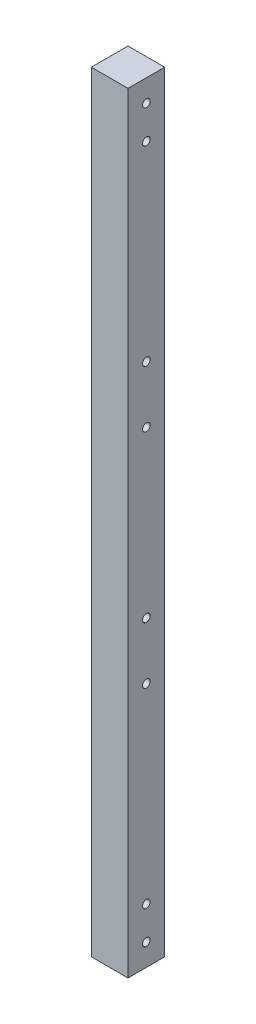
ISO-10303-21;
HEADER;
FILE_DESCRIPTION(('STEP AP214'),'2;1');
FILE_NAME('part.step','',(''),(''),'','','');
FILE_SCHEMA(('AUTOMOTIVE_DESIGN { 1 0 10303 214 1 1 1 1 }'));
ENDSEC;
DATA;
#1=APPLICATION_CONTEXT('core data for automotive mechanical design processes');
#2=APPLICATION_PROTOCOL_DEFINITION('international standard','automotive_design',2000,#1);
#3=PRODUCT_CONTEXT('',#1,'mechanical');
#4=PRODUCT('Part','Part','',(#3));
#5=PRODUCT_RELATED_PRODUCT_CATEGORY('part','',(#4));
#6=PRODUCT_DEFINITION_FORMATION('','',#4);
#7=PRODUCT_DEFINITION_CONTEXT('part definition',#1,'design');
#8=PRODUCT_DEFINITION('design','',#6,#7);
#9=PRODUCT_DEFINITION_SHAPE('','',#8);
#10=(LENGTH_UNIT() NAMED_UNIT(*) SI_UNIT(.MILLI.,.METRE.));
#11=(NAMED_UNIT(*) PLANE_ANGLE_UNIT() SI_UNIT($,.RADIAN.));
#12=(NAMED_UNIT(*) SI_UNIT($,.STERADIAN.) SOLID_ANGLE_UNIT());
#13=UNCERTAINTY_MEASURE_WITH_UNIT(LENGTH_MEASURE(1.E-05),#10,'distance_accuracy_value','');
#14=(GEOMETRIC_REPRESENTATION_CONTEXT(3) GLOBAL_UNCERTAINTY_ASSIGNED_CONTEXT((#13)) GLOBAL_UNIT_ASSIGNED_CONTEXT((#10,
#11,#12)) REPRESENTATION_CONTEXT('',''));
#15=CARTESIAN_POINT('',(0.,0.,0.));
#16=DIRECTION('',(0.,0.,1.));
#17=DIRECTION('',(1.,0.,0.));
#18=AXIS2_PLACEMENT_3D('',#15,#16,#17);
#19=CARTESIAN_POINT('',(-14.8983739837398,420.,-2.41869918699187));
#20=DIRECTION('',(1.,0.,0.));
#21=DIRECTION('',(0.,0.,-1.));
#22=AXIS2_PLACEMENT_3D('',#19,#20,#21);
#23=PLANE('',#22);
#24=CARTESIAN_POINT('',(-14.8983739837398,286.,7.58130081300811));
#25=DIRECTION('',(1.,0.,0.));
#26=DIRECTION('',(0.,0.,-1.));
#27=AXIS2_PLACEMENT_3D('',#24,#25,#26);
#28=CIRCLE('',#27,2.1);
#29=CARTESIAN_POINT('',(-14.8983739837398,286.,5.48130081300812));
#30=VERTEX_POINT('',#29);
#31=EDGE_CURVE('E140',#30,#30,#28,.T.);
#32=ORIENTED_EDGE('',*,*,#31,.T.);
#33=EDGE_LOOP('',(#32));
#34=FACE_BOUND('',#33,.T.);
#35=CARTESIAN_POINT('',(-14.8983739837398,134.,7.58130081300811));
#36=DIRECTION('',(1.,0.,0.));
#37=DIRECTION('',(0.,0.,1.));
#38=AXIS2_PLACEMENT_3D('',#35,#36,#37);
#39=CIRCLE('',#38,2.1);
#40=CARTESIAN_POINT('',(-14.8983739837398,134.,9.68130081300811));
#41=VERTEX_POINT('',#40);
#42=EDGE_CURVE('E146',#41,#41,#39,.T.);
#43=ORIENTED_EDGE('',*,*,#42,.T.);
#44=EDGE_LOOP('',(#43));
#45=FACE_BOUND('',#44,.T.);
#46=CARTESIAN_POINT('',(-14.8983739837398,165.,7.58130081300811));
#47=DIRECTION('',(1.,0.,0.));
#48=DIRECTION('',(0.,0.,1.));
#49=AXIS2_PLACEMENT_3D('',#46,#47,#48);
#50=CIRCLE('',#49,2.1);
#51=CARTESIAN_POINT('',(-14.8983739837398,165.,9.68130081300811));
#52=VERTEX_POINT('',#51);
#53=EDGE_CURVE('E147',#52,#52,#50,.T.);
#54=ORIENTED_EDGE('',*,*,#53,.T.);
#55=EDGE_LOOP('',(#54));
#56=FACE_BOUND('',#55,.T.);
#57=CARTESIAN_POINT('',(-14.8983739837398,255.,7.58130081300811));
#58=DIRECTION('',(1.,0.,0.));
#59=DIRECTION('',(0.,0.,-1.));
#60=AXIS2_PLACEMENT_3D('',#57,#58,#59);
#61=CIRCLE('',#60,2.1);
#62=CARTESIAN_POINT('',(-14.8983739837398,255.,5.48130081300811));
#63=VERTEX_POINT('',#62);
#64=EDGE_CURVE('E123',#63,#63,#61,.T.);
#65=ORIENTED_EDGE('',*,*,#64,.T.);
#66=EDGE_LOOP('',(#65));
#67=FACE_BOUND('',#66,.T.);
#68=CARTESIAN_POINT('',(-14.8983739837398,12.,7.58130081300813));
#69=DIRECTION('',(1.,0.,0.));
#70=DIRECTION('',(0.,0.,1.));
#71=AXIS2_PLACEMENT_3D('',#68,#69,#70);
#72=CIRCLE('',#71,2.1);
#73=CARTESIAN_POINT('',(-14.8983739837398,12.,9.68130081300812));
#74=VERTEX_POINT('',#73);
#75=EDGE_CURVE('E122',#74,#74,#72,.T.);
#76=ORIENTED_EDGE('',*,*,#75,.T.);
#77=EDGE_LOOP('',(#76));
#78=FACE_BOUND('',#77,.T.);
#79=CARTESIAN_POINT('',(-14.8983739837398,30.,7.58130081300813));
#80=DIRECTION('',(1.,0.,0.));
#81=DIRECTION('',(0.,0.,1.));
#82=AXIS2_PLACEMENT_3D('',#79,#80,#81);
#83=CIRCLE('',#82,2.1);
#84=CARTESIAN_POINT('',(-14.8983739837398,30.,9.68130081300812));
#85=VERTEX_POINT('',#84);
#86=EDGE_CURVE('E129',#85,#85,#83,.T.);
#87=ORIENTED_EDGE('',*,*,#86,.T.);
#88=EDGE_LOOP('',(#87));
#89=FACE_BOUND('',#88,.T.);
#90=CARTESIAN_POINT('',(-14.8983739837398,408.,7.58130081300813));
#91=DIRECTION('',(1.,0.,0.));
#92=DIRECTION('',(0.,0.,-1.));
#93=AXIS2_PLACEMENT_3D('',#90,#91,#92);
#94=CIRCLE('',#93,2.09999999999999);
#95=CARTESIAN_POINT('',(-14.8983739837398,408.,5.48130081300814));
#96=VERTEX_POINT('',#95);
#97=EDGE_CURVE('E116',#96,#96,#94,.T.);
#98=ORIENTED_EDGE('',*,*,#97,.T.);
#99=EDGE_LOOP('',(#98));
#100=FACE_BOUND('',#99,.T.);
#101=CARTESIAN_POINT('',(-14.8983739837398,390.,7.58130081300813));
#102=DIRECTION('',(1.,0.,0.));
#103=DIRECTION('',(0.,0.,-1.));
#104=AXIS2_PLACEMENT_3D('',#101,#102,#103);
#105=CIRCLE('',#104,2.09999999999999);
#106=CARTESIAN_POINT('',(-14.8983739837398,390.,5.48130081300813));
#107=VERTEX_POINT('',#106);
#108=EDGE_CURVE('E102',#107,#107,#105,.T.);
#109=ORIENTED_EDGE('',*,*,#108,.T.);
#110=EDGE_LOOP('',(#109));
#111=FACE_BOUND('',#110,.T.);
#112=DIRECTION('',(0.,0.,1.));
#113=VECTOR('',#112,1.);
#114=CARTESIAN_POINT('',(-14.8983739837398,0.,-2.41869918699187));
#115=LINE('',#114,#113);
#116=CARTESIAN_POINT('',(-14.8983739837398,0.,-2.41869918699187));
#117=VERTEX_POINT('',#116);
#118=CARTESIAN_POINT('',(-14.8983739837398,0.,17.5813008130081));
#119=VERTEX_POINT('',#118);
#120=EDGE_CURVE('E99',#117,#119,#115,.T.);
#121=ORIENTED_EDGE('',*,*,#120,.T.);
#122=DIRECTION('',(0.,-1.,0.));
#123=VECTOR('',#122,1.);
#124=CARTESIAN_POINT('',(-14.8983739837398,420.,17.5813008130081));
#125=LINE('',#124,#123);
#126=CARTESIAN_POINT('',(-14.8983739837398,420.,17.5813008130081));
#127=VERTEX_POINT('',#126);
#128=EDGE_CURVE('E11',#127,#119,#125,.T.);
#129=ORIENTED_EDGE('',*,*,#128,.F.);
#130=DIRECTION('',(0.,0.,1.));
#131=VECTOR('',#130,1.);
#132=CARTESIAN_POINT('',(-14.8983739837398,420.,-2.41869918699187));
#133=LINE('',#132,#131);
#134=CARTESIAN_POINT('',(-14.8983739837398,420.,-2.41869918699187));
#135=VERTEX_POINT('',#134);
#136=EDGE_CURVE('E87',#135,#127,#133,.T.);
#137=ORIENTED_EDGE('',*,*,#136,.F.);
#138=DIRECTION('',(0.,-1.,0.));
#139=VECTOR('',#138,1.);
#140=CARTESIAN_POINT('',(-14.8983739837398,420.,-2.41869918699187));
#141=LINE('',#140,#139);
#142=EDGE_CURVE('E95',#135,#117,#141,.T.);
#143=ORIENTED_EDGE('',*,*,#142,.T.);
#144=EDGE_LOOP('',(#121,#129,#137,#143));
#145=FACE_BOUND('',#144,.T.);
#146=ADVANCED_FACE('F36',(#34,#45,#56,#67,#78,#89,#100,#111,#145),#23,.F.);
#147=CARTESIAN_POINT('',(-14.8983739837398,420.,17.5813008130081));
#148=DIRECTION('',(0.,0.,-1.));
#149=DIRECTION('',(-1.,0.,0.));
#150=AXIS2_PLACEMENT_3D('',#147,#148,#149);
#151=PLANE('',#150);
#152=DIRECTION('',(1.,0.,0.));
#153=VECTOR('',#152,1.);
#154=CARTESIAN_POINT('',(-14.8983739837398,0.,17.5813008130081));
#155=LINE('',#154,#153);
#156=CARTESIAN_POINT('',(5.10162601626017,0.,17.5813008130081));
#157=VERTEX_POINT('',#156);
#158=EDGE_CURVE('E91',#119,#157,#155,.T.);
#159=ORIENTED_EDGE('',*,*,#158,.T.);
#160=DIRECTION('',(0.,-1.,0.));
#161=VECTOR('',#160,1.);
#162=CARTESIAN_POINT('',(5.10162601626017,420.,17.5813008130081));
#163=LINE('',#162,#161);
#164=CARTESIAN_POINT('',(5.10162601626017,420.,17.5813008130081));
#165=VERTEX_POINT('',#164);
#166=EDGE_CURVE('E44',#165,#157,#163,.T.);
#167=ORIENTED_EDGE('',*,*,#166,.F.);
#168=DIRECTION('',(1.,0.,0.));
#169=VECTOR('',#168,1.);
#170=CARTESIAN_POINT('',(-14.8983739837398,420.,17.5813008130081));
#171=LINE('',#170,#169);
#172=EDGE_CURVE('E82',#127,#165,#171,.T.);
#173=ORIENTED_EDGE('',*,*,#172,.F.);
#174=ORIENTED_EDGE('',*,*,#128,.T.);
#175=EDGE_LOOP('',(#159,#167,#173,#174));
#176=FACE_BOUND('',#175,.T.);
#177=ADVANCED_FACE('F90',(#176),#151,.F.);
#178=CARTESIAN_POINT('',(5.10162601626017,420.,-2.41869918699187));
#179=DIRECTION('',(-1.,0.,0.));
#180=DIRECTION('',(0.,0.,1.));
#181=AXIS2_PLACEMENT_3D('',#178,#179,#180);
#182=PLANE('',#181);
#183=CARTESIAN_POINT('',(5.10162601626017,286.,7.58130081300811));
#184=DIRECTION('',(1.,0.,0.));
#185=DIRECTION('',(0.,0.,-1.));
#186=AXIS2_PLACEMENT_3D('',#183,#184,#185);
#187=CIRCLE('',#186,2.1);
#188=CARTESIAN_POINT('',(5.10162601626017,286.,5.48130081300812));
#189=VERTEX_POINT('',#188);
#190=EDGE_CURVE('E150',#189,#189,#187,.T.);
#191=ORIENTED_EDGE('',*,*,#190,.F.);
#192=EDGE_LOOP('',(#191));
#193=FACE_BOUND('',#192,.T.);
#194=CARTESIAN_POINT('',(5.10162601626017,134.,7.58130081300811));
#195=DIRECTION('',(1.,0.,0.));
#196=DIRECTION('',(0.,0.,1.));
#197=AXIS2_PLACEMENT_3D('',#194,#195,#196);
#198=CIRCLE('',#197,2.1);
#199=CARTESIAN_POINT('',(5.10162601626017,134.,9.68130081300811));
#200=VERTEX_POINT('',#199);
#201=EDGE_CURVE('E143',#200,#200,#198,.T.);
#202=ORIENTED_EDGE('',*,*,#201,.F.);
#203=EDGE_LOOP('',(#202));
#204=FACE_BOUND('',#203,.T.);
#205=CARTESIAN_POINT('',(5.10162601626017,165.,7.58130081300811));
#206=DIRECTION('',(1.,0.,0.));
#207=DIRECTION('',(0.,0.,1.));
#208=AXIS2_PLACEMENT_3D('',#205,#206,#207);
#209=CIRCLE('',#208,2.1);
#210=CARTESIAN_POINT('',(5.10162601626017,165.,9.68130081300811));
#211=VERTEX_POINT('',#210);
#212=EDGE_CURVE('E155',#211,#211,#209,.T.);
#213=ORIENTED_EDGE('',*,*,#212,.F.);
#214=EDGE_LOOP('',(#213));
#215=FACE_BOUND('',#214,.T.);
#216=CARTESIAN_POINT('',(5.10162601626017,255.,7.58130081300811));
#217=DIRECTION('',(1.,0.,0.));
#218=DIRECTION('',(0.,0.,-1.));
#219=AXIS2_PLACEMENT_3D('',#216,#217,#218);
#220=CIRCLE('',#219,2.1);
#221=CARTESIAN_POINT('',(5.10162601626017,255.,5.48130081300811));
#222=VERTEX_POINT('',#221);
#223=EDGE_CURVE('E137',#222,#222,#220,.T.);
#224=ORIENTED_EDGE('',*,*,#223,.F.);
#225=EDGE_LOOP('',(#224));
#226=FACE_BOUND('',#225,.T.);
#227=CARTESIAN_POINT('',(5.10162601626017,12.,7.58130081300813));
#228=DIRECTION('',(1.,0.,0.));
#229=DIRECTION('',(0.,0.,1.));
#230=AXIS2_PLACEMENT_3D('',#227,#228,#229);
#231=CIRCLE('',#230,2.1);
#232=CARTESIAN_POINT('',(5.10162601626017,12.,9.68130081300812));
#233=VERTEX_POINT('',#232);
#234=EDGE_CURVE('E119',#233,#233,#231,.T.);
#235=ORIENTED_EDGE('',*,*,#234,.F.);
#236=EDGE_LOOP('',(#235));
#237=FACE_BOUND('',#236,.T.);
#238=CARTESIAN_POINT('',(5.10162601626017,30.,7.58130081300813));
#239=DIRECTION('',(1.,0.,0.));
#240=DIRECTION('',(0.,0.,1.));
#241=AXIS2_PLACEMENT_3D('',#238,#239,#240);
#242=CIRCLE('',#241,2.1);
#243=CARTESIAN_POINT('',(5.10162601626017,30.,9.68130081300812));
#244=VERTEX_POINT('',#243);
#245=EDGE_CURVE('E126',#244,#244,#242,.T.);
#246=ORIENTED_EDGE('',*,*,#245,.F.);
#247=EDGE_LOOP('',(#246));
#248=FACE_BOUND('',#247,.T.);
#249=CARTESIAN_POINT('',(5.10162601626017,408.,7.58130081300813));
#250=DIRECTION('',(1.,0.,0.));
#251=DIRECTION('',(0.,0.,-1.));
#252=AXIS2_PLACEMENT_3D('',#249,#250,#251);
#253=CIRCLE('',#252,2.09999999999999);
#254=CARTESIAN_POINT('',(5.10162601626017,408.,5.48130081300814));
#255=VERTEX_POINT('',#254);
#256=EDGE_CURVE('E132',#255,#255,#253,.T.);
#257=ORIENTED_EDGE('',*,*,#256,.F.);
#258=EDGE_LOOP('',(#257));
#259=FACE_BOUND('',#258,.T.);
#260=CARTESIAN_POINT('',(5.10162601626017,390.,7.58130081300813));
#261=DIRECTION('',(1.,0.,0.));
#262=DIRECTION('',(0.,0.,-1.));
#263=AXIS2_PLACEMENT_3D('',#260,#261,#262);
#264=CIRCLE('',#263,2.09999999999999);
#265=CARTESIAN_POINT('',(5.10162601626017,390.,5.48130081300813));
#266=VERTEX_POINT('',#265);
#267=EDGE_CURVE('E113',#266,#266,#264,.T.);
#268=ORIENTED_EDGE('',*,*,#267,.F.);
#269=EDGE_LOOP('',(#268));
#270=FACE_BOUND('',#269,.T.);
#271=DIRECTION('',(0.,0.,-1.));
#272=VECTOR('',#271,1.);
#273=CARTESIAN_POINT('',(5.10162601626017,0.,-2.41869918699187));
#274=LINE('',#273,#272);
#275=CARTESIAN_POINT('',(5.10162601626017,0.,-2.41869918699187));
#276=VERTEX_POINT('',#275);
#277=EDGE_CURVE('E69',#157,#276,#274,.T.);
#278=ORIENTED_EDGE('',*,*,#277,.T.);
#279=DIRECTION('',(0.,-1.,0.));
#280=VECTOR('',#279,1.);
#281=CARTESIAN_POINT('',(5.10162601626017,420.,-2.41869918699187));
#282=LINE('',#281,#280);
#283=CARTESIAN_POINT('',(5.10162601626017,420.,-2.41869918699187));
#284=VERTEX_POINT('',#283);
#285=EDGE_CURVE('E92',#284,#276,#282,.T.);
#286=ORIENTED_EDGE('',*,*,#285,.F.);
#287=DIRECTION('',(0.,0.,-1.));
#288=VECTOR('',#287,1.);
#289=CARTESIAN_POINT('',(5.10162601626017,420.,-2.41869918699187));
#290=LINE('',#289,#288);
#291=EDGE_CURVE('E85',#165,#284,#290,.T.);
#292=ORIENTED_EDGE('',*,*,#291,.F.);
#293=ORIENTED_EDGE('',*,*,#166,.T.);
#294=EDGE_LOOP('',(#278,#286,#292,#293));
#295=FACE_BOUND('',#294,.T.);
#296=ADVANCED_FACE('F93',(#193,#204,#215,#226,#237,#248,#259,#270,#295),#182,.F.);
#297=CARTESIAN_POINT('',(-14.8983739837398,420.,-2.41869918699187));
#298=DIRECTION('',(0.,0.,1.));
#299=DIRECTION('',(1.,0.,0.));
#300=AXIS2_PLACEMENT_3D('',#297,#298,#299);
#301=PLANE('',#300);
#302=DIRECTION('',(-1.,0.,0.));
#303=VECTOR('',#302,1.);
#304=CARTESIAN_POINT('',(-14.8983739837398,0.,-2.41869918699187));
#305=LINE('',#304,#303);
#306=EDGE_CURVE('E75',#276,#117,#305,.T.);
#307=ORIENTED_EDGE('',*,*,#306,.T.);
#308=ORIENTED_EDGE('',*,*,#142,.F.);
#309=DIRECTION('',(-1.,0.,0.));
#310=VECTOR('',#309,1.);
#311=CARTESIAN_POINT('',(-14.8983739837398,420.,-2.41869918699187));
#312=LINE('',#311,#310);
#313=EDGE_CURVE('E52',#284,#135,#312,.T.);
#314=ORIENTED_EDGE('',*,*,#313,.F.);
#315=ORIENTED_EDGE('',*,*,#285,.T.);
#316=EDGE_LOOP('',(#307,#308,#314,#315));
#317=FACE_BOUND('',#316,.T.);
#318=ADVANCED_FACE('F107',(#317),#301,.F.);
#319=CARTESIAN_POINT('',(0.,420.,0.));
#320=DIRECTION('',(0.,1.,0.));
#321=DIRECTION('',(0.,0.,1.));
#322=AXIS2_PLACEMENT_3D('',#319,#320,#321);
#323=PLANE('',#322);
#324=ORIENTED_EDGE('',*,*,#136,.T.);
#325=ORIENTED_EDGE('',*,*,#172,.T.);
#326=ORIENTED_EDGE('',*,*,#291,.T.);
#327=ORIENTED_EDGE('',*,*,#313,.T.);
#328=EDGE_LOOP('',(#324,#325,#326,#327));
#329=FACE_BOUND('',#328,.T.);
#330=ADVANCED_FACE('F83',(#329),#323,.T.);
#331=CARTESIAN_POINT('',(0.,0.,0.));
#332=DIRECTION('',(0.,1.,0.));
#333=DIRECTION('',(0.,0.,1.));
#334=AXIS2_PLACEMENT_3D('',#331,#332,#333);
#335=PLANE('',#334);
#336=ORIENTED_EDGE('',*,*,#120,.F.);
#337=ORIENTED_EDGE('',*,*,#306,.F.);
#338=ORIENTED_EDGE('',*,*,#277,.F.);
#339=ORIENTED_EDGE('',*,*,#158,.F.);
#340=EDGE_LOOP('',(#336,#337,#338,#339));
#341=FACE_BOUND('',#340,.T.);
#342=ADVANCED_FACE('F110',(#341),#335,.F.);
#343=CARTESIAN_POINT('',(-14.8983739837398,390.,7.58130081300813));
#344=DIRECTION('',(1.,0.,0.));
#345=DIRECTION('',(0.,0.,-1.));
#346=AXIS2_PLACEMENT_3D('',#343,#344,#345);
#347=CYLINDRICAL_SURFACE('',#346,2.09999999999999);
#348=ORIENTED_EDGE('',*,*,#108,.F.);
#349=EDGE_LOOP('',(#348));
#350=FACE_BOUND('',#349,.T.);
#351=ORIENTED_EDGE('',*,*,#267,.T.);
#352=EDGE_LOOP('',(#351));
#353=FACE_BOUND('',#352,.T.);
#354=ADVANCED_FACE('F185',(#350,#353),#347,.F.);
#355=CARTESIAN_POINT('',(-14.8983739837398,408.,7.58130081300813));
#356=DIRECTION('',(1.,0.,0.));
#357=DIRECTION('',(0.,0.,-1.));
#358=AXIS2_PLACEMENT_3D('',#355,#356,#357);
#359=CYLINDRICAL_SURFACE('',#358,2.09999999999999);
#360=ORIENTED_EDGE('',*,*,#97,.F.);
#361=EDGE_LOOP('',(#360));
#362=FACE_BOUND('',#361,.T.);
#363=ORIENTED_EDGE('',*,*,#256,.T.);
#364=EDGE_LOOP('',(#363));
#365=FACE_BOUND('',#364,.T.);
#366=ADVANCED_FACE('F187',(#362,#365),#359,.F.);
#367=CARTESIAN_POINT('',(-14.8983739837398,30.,7.58130081300813));
#368=DIRECTION('',(1.,0.,0.));
#369=DIRECTION('',(0.,0.,-1.));
#370=AXIS2_PLACEMENT_3D('',#367,#368,#369);
#371=CYLINDRICAL_SURFACE('',#370,2.1);
#372=ORIENTED_EDGE('',*,*,#86,.F.);
#373=EDGE_LOOP('',(#372));
#374=FACE_BOUND('',#373,.T.);
#375=ORIENTED_EDGE('',*,*,#245,.T.);
#376=EDGE_LOOP('',(#375));
#377=FACE_BOUND('',#376,.T.);
#378=ADVANCED_FACE('F194',(#374,#377),#371,.F.);
#379=CARTESIAN_POINT('',(-14.8983739837398,12.,7.58130081300813));
#380=DIRECTION('',(1.,0.,0.));
#381=DIRECTION('',(0.,0.,-1.));
#382=AXIS2_PLACEMENT_3D('',#379,#380,#381);
#383=CYLINDRICAL_SURFACE('',#382,2.1);
#384=ORIENTED_EDGE('',*,*,#75,.F.);
#385=EDGE_LOOP('',(#384));
#386=FACE_BOUND('',#385,.T.);
#387=ORIENTED_EDGE('',*,*,#234,.T.);
#388=EDGE_LOOP('',(#387));
#389=FACE_BOUND('',#388,.T.);
#390=ADVANCED_FACE('F223',(#386,#389),#383,.F.);
#391=CARTESIAN_POINT('',(-14.8983739837398,255.,7.58130081300811));
#392=DIRECTION('',(1.,0.,0.));
#393=DIRECTION('',(0.,0.,-1.));
#394=AXIS2_PLACEMENT_3D('',#391,#392,#393);
#395=CYLINDRICAL_SURFACE('',#394,2.1);
#396=ORIENTED_EDGE('',*,*,#64,.F.);
#397=EDGE_LOOP('',(#396));
#398=FACE_BOUND('',#397,.T.);
#399=ORIENTED_EDGE('',*,*,#223,.T.);
#400=EDGE_LOOP('',(#399));
#401=FACE_BOUND('',#400,.T.);
#402=ADVANCED_FACE('F167',(#398,#401),#395,.F.);
#403=CARTESIAN_POINT('',(-14.8983739837398,165.,7.58130081300811));
#404=DIRECTION('',(1.,0.,0.));
#405=DIRECTION('',(0.,0.,-1.));
#406=AXIS2_PLACEMENT_3D('',#403,#404,#405);
#407=CYLINDRICAL_SURFACE('',#406,2.1);
#408=ORIENTED_EDGE('',*,*,#53,.F.);
#409=EDGE_LOOP('',(#408));
#410=FACE_BOUND('',#409,.T.);
#411=ORIENTED_EDGE('',*,*,#212,.T.);
#412=EDGE_LOOP('',(#411));
#413=FACE_BOUND('',#412,.T.);
#414=ADVANCED_FACE('F163',(#410,#413),#407,.F.);
#415=CARTESIAN_POINT('',(-14.8983739837398,134.,7.58130081300811));
#416=DIRECTION('',(1.,0.,0.));
#417=DIRECTION('',(0.,0.,-1.));
#418=AXIS2_PLACEMENT_3D('',#415,#416,#417);
#419=CYLINDRICAL_SURFACE('',#418,2.1);
#420=ORIENTED_EDGE('',*,*,#42,.F.);
#421=EDGE_LOOP('',(#420));
#422=FACE_BOUND('',#421,.T.);
#423=ORIENTED_EDGE('',*,*,#201,.T.);
#424=EDGE_LOOP('',(#423));
#425=FACE_BOUND('',#424,.T.);
#426=ADVANCED_FACE('F166',(#422,#425),#419,.F.);
#427=CARTESIAN_POINT('',(-14.8983739837398,286.,7.58130081300811));
#428=DIRECTION('',(1.,0.,0.));
#429=DIRECTION('',(0.,0.,-1.));
#430=AXIS2_PLACEMENT_3D('',#427,#428,#429);
#431=CYLINDRICAL_SURFACE('',#430,2.1);
#432=ORIENTED_EDGE('',*,*,#31,.F.);
#433=EDGE_LOOP('',(#432));
#434=FACE_BOUND('',#433,.T.);
#435=ORIENTED_EDGE('',*,*,#190,.T.);
#436=EDGE_LOOP('',(#435));
#437=FACE_BOUND('',#436,.T.);
#438=ADVANCED_FACE('F212',(#434,#437),#431,.F.);
#439=CLOSED_SHELL('',(#146,#177,#296,#318,#330,#342,#354,#366,#378,#390,#402,#414,#426,#438));
#440=MANIFOLD_SOLID_BREP('B2',#439);
#441=ADVANCED_BREP_SHAPE_REPRESENTATION('',(#18,#440),#14);
#442=SHAPE_DEFINITION_REPRESENTATION(#9,#441);
ENDSEC;
END-ISO-10303-21;
